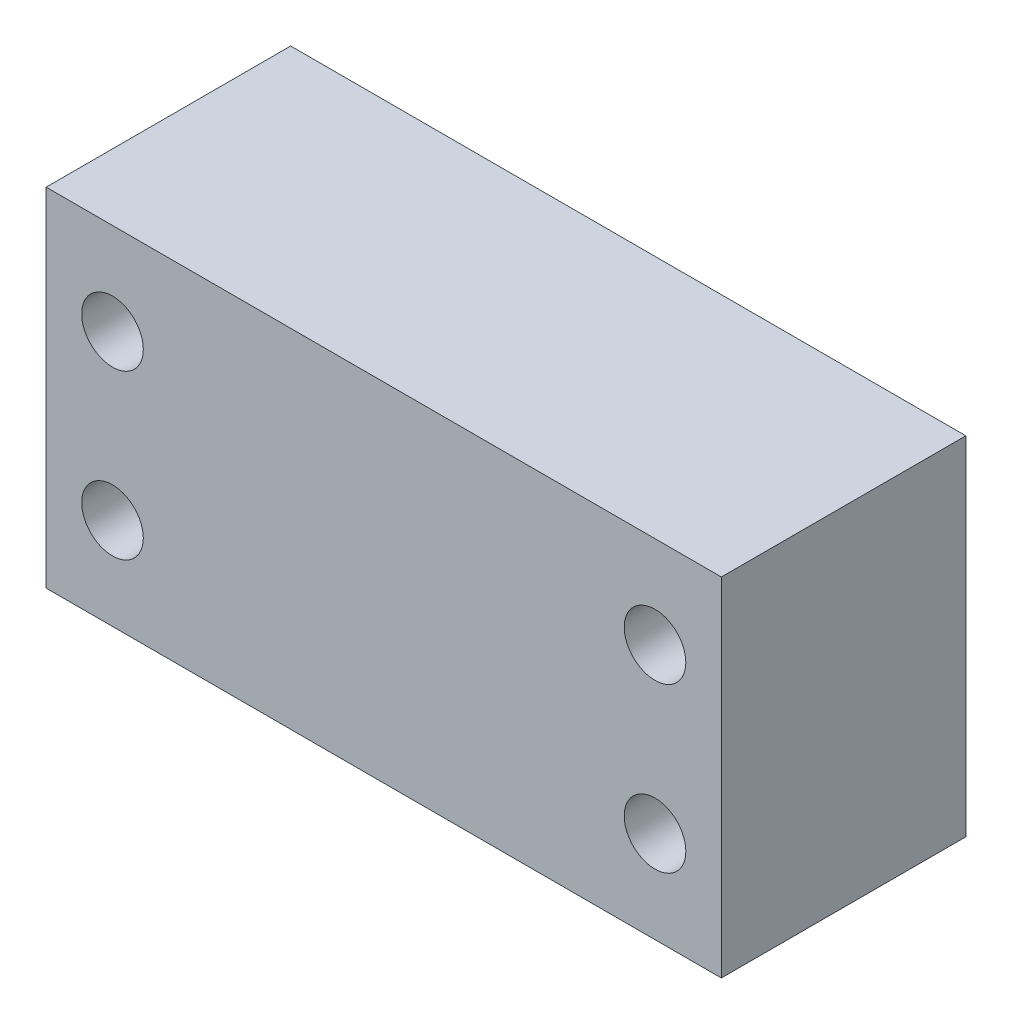
ISO-10303-21;
HEADER;
FILE_DESCRIPTION(('STEP AP214'),'2;1');
FILE_NAME('part.step','',(''),(''),'','','');
FILE_SCHEMA(('AUTOMOTIVE_DESIGN { 1 0 10303 214 1 1 1 1 }'));
ENDSEC;
DATA;
#1=APPLICATION_CONTEXT('core data for automotive mechanical design processes');
#2=APPLICATION_PROTOCOL_DEFINITION('international standard','automotive_design',2000,#1);
#3=PRODUCT_CONTEXT('',#1,'mechanical');
#4=PRODUCT('Part','Part','',(#3));
#5=PRODUCT_RELATED_PRODUCT_CATEGORY('part','',(#4));
#6=PRODUCT_DEFINITION_FORMATION('','',#4);
#7=PRODUCT_DEFINITION_CONTEXT('part definition',#1,'design');
#8=PRODUCT_DEFINITION('design','',#6,#7);
#9=PRODUCT_DEFINITION_SHAPE('','',#8);
#10=(LENGTH_UNIT() NAMED_UNIT(*) SI_UNIT(.MILLI.,.METRE.));
#11=(NAMED_UNIT(*) PLANE_ANGLE_UNIT() SI_UNIT($,.RADIAN.));
#12=(NAMED_UNIT(*) SI_UNIT($,.STERADIAN.) SOLID_ANGLE_UNIT());
#13=UNCERTAINTY_MEASURE_WITH_UNIT(LENGTH_MEASURE(1.E-05),#10,'distance_accuracy_value','');
#14=(GEOMETRIC_REPRESENTATION_CONTEXT(3) GLOBAL_UNCERTAINTY_ASSIGNED_CONTEXT((#13)) GLOBAL_UNIT_ASSIGNED_CONTEXT((#10,
#11,#12)) REPRESENTATION_CONTEXT('',''));
#15=CARTESIAN_POINT('',(0.,0.,0.));
#16=DIRECTION('',(0.,0.,1.));
#17=DIRECTION('',(1.,0.,0.));
#18=AXIS2_PLACEMENT_3D('',#15,#16,#17);
#19=CARTESIAN_POINT('',(18.0975,9.3091,13.1064));
#20=DIRECTION('',(-1.,0.,0.));
#21=DIRECTION('',(0.,0.,1.));
#22=AXIS2_PLACEMENT_3D('',#19,#20,#21);
#23=PLANE('',#22);
#24=DIRECTION('',(0.,1.,0.));
#25=VECTOR('',#24,1.);
#26=CARTESIAN_POINT('',(18.0975,9.3091,0.));
#27=LINE('',#26,#25);
#28=CARTESIAN_POINT('',(18.0975,-9.3091,0.));
#29=VERTEX_POINT('',#28);
#30=CARTESIAN_POINT('',(18.0975,9.3091,0.));
#31=VERTEX_POINT('',#30);
#32=EDGE_CURVE('E99',#29,#31,#27,.T.);
#33=ORIENTED_EDGE('',*,*,#32,.T.);
#34=DIRECTION('',(0.,0.,-1.));
#35=VECTOR('',#34,1.);
#36=CARTESIAN_POINT('',(18.0975,9.3091,13.1064));
#37=LINE('',#36,#35);
#38=CARTESIAN_POINT('',(18.0975,9.3091,13.1064));
#39=VERTEX_POINT('',#38);
#40=EDGE_CURVE('E11',#39,#31,#37,.T.);
#41=ORIENTED_EDGE('',*,*,#40,.F.);
#42=DIRECTION('',(0.,1.,0.));
#43=VECTOR('',#42,1.);
#44=CARTESIAN_POINT('',(18.0975,9.3091,13.1064));
#45=LINE('',#44,#43);
#46=CARTESIAN_POINT('',(18.0975,-9.3091,13.1064));
#47=VERTEX_POINT('',#46);
#48=EDGE_CURVE('E87',#47,#39,#45,.T.);
#49=ORIENTED_EDGE('',*,*,#48,.F.);
#50=DIRECTION('',(0.,0.,-1.));
#51=VECTOR('',#50,1.);
#52=CARTESIAN_POINT('',(18.0975,-9.3091,13.1064));
#53=LINE('',#52,#51);
#54=EDGE_CURVE('E95',#47,#29,#53,.T.);
#55=ORIENTED_EDGE('',*,*,#54,.T.);
#56=EDGE_LOOP('',(#33,#41,#49,#55));
#57=FACE_BOUND('',#56,.T.);
#58=ADVANCED_FACE('F36',(#57),#23,.F.);
#59=CARTESIAN_POINT('',(-18.0975,9.3091,13.1064));
#60=DIRECTION('',(0.,-1.,0.));
#61=DIRECTION('',(0.,0.,-1.));
#62=AXIS2_PLACEMENT_3D('',#59,#60,#61);
#63=PLANE('',#62);
#64=DIRECTION('',(-1.,0.,0.));
#65=VECTOR('',#64,1.);
#66=CARTESIAN_POINT('',(-18.0975,9.3091,0.));
#67=LINE('',#66,#65);
#68=CARTESIAN_POINT('',(-18.0975,9.3091,0.));
#69=VERTEX_POINT('',#68);
#70=EDGE_CURVE('E91',#31,#69,#67,.T.);
#71=ORIENTED_EDGE('',*,*,#70,.T.);
#72=DIRECTION('',(0.,0.,-1.));
#73=VECTOR('',#72,1.);
#74=CARTESIAN_POINT('',(-18.0975,9.3091,13.1064));
#75=LINE('',#74,#73);
#76=CARTESIAN_POINT('',(-18.0975,9.3091,13.1064));
#77=VERTEX_POINT('',#76);
#78=EDGE_CURVE('E44',#77,#69,#75,.T.);
#79=ORIENTED_EDGE('',*,*,#78,.F.);
#80=DIRECTION('',(-1.,0.,0.));
#81=VECTOR('',#80,1.);
#82=CARTESIAN_POINT('',(-18.0975,9.3091,13.1064));
#83=LINE('',#82,#81);
#84=EDGE_CURVE('E82',#39,#77,#83,.T.);
#85=ORIENTED_EDGE('',*,*,#84,.F.);
#86=ORIENTED_EDGE('',*,*,#40,.T.);
#87=EDGE_LOOP('',(#71,#79,#85,#86));
#88=FACE_BOUND('',#87,.T.);
#89=ADVANCED_FACE('F90',(#88),#63,.F.);
#90=CARTESIAN_POINT('',(-18.0975,9.3091,13.1064));
#91=DIRECTION('',(1.,0.,0.));
#92=DIRECTION('',(0.,1.,0.));
#93=AXIS2_PLACEMENT_3D('',#90,#91,#92);
#94=PLANE('',#93);
#95=DIRECTION('',(0.,-1.,0.));
#96=VECTOR('',#95,1.);
#97=CARTESIAN_POINT('',(-18.0975,9.3091,0.));
#98=LINE('',#97,#96);
#99=CARTESIAN_POINT('',(-18.0975,-9.3091,0.));
#100=VERTEX_POINT('',#99);
#101=EDGE_CURVE('E69',#69,#100,#98,.T.);
#102=ORIENTED_EDGE('',*,*,#101,.T.);
#103=DIRECTION('',(0.,0.,-1.));
#104=VECTOR('',#103,1.);
#105=CARTESIAN_POINT('',(-18.0975,-9.3091,13.1064));
#106=LINE('',#105,#104);
#107=CARTESIAN_POINT('',(-18.0975,-9.3091,13.1064));
#108=VERTEX_POINT('',#107);
#109=EDGE_CURVE('E92',#108,#100,#106,.T.);
#110=ORIENTED_EDGE('',*,*,#109,.F.);
#111=DIRECTION('',(0.,-1.,0.));
#112=VECTOR('',#111,1.);
#113=CARTESIAN_POINT('',(-18.0975,9.3091,13.1064));
#114=LINE('',#113,#112);
#115=EDGE_CURVE('E85',#77,#108,#114,.T.);
#116=ORIENTED_EDGE('',*,*,#115,.F.);
#117=ORIENTED_EDGE('',*,*,#78,.T.);
#118=EDGE_LOOP('',(#102,#110,#116,#117));
#119=FACE_BOUND('',#118,.T.);
#120=ADVANCED_FACE('F93',(#119),#94,.F.);
#121=CARTESIAN_POINT('',(-18.0975,-9.3091,13.1064));
#122=DIRECTION('',(0.,1.,0.));
#123=DIRECTION('',(0.,0.,1.));
#124=AXIS2_PLACEMENT_3D('',#121,#122,#123);
#125=PLANE('',#124);
#126=DIRECTION('',(1.,0.,0.));
#127=VECTOR('',#126,1.);
#128=CARTESIAN_POINT('',(-18.0975,-9.3091,0.));
#129=LINE('',#128,#127);
#130=EDGE_CURVE('E75',#100,#29,#129,.T.);
#131=ORIENTED_EDGE('',*,*,#130,.T.);
#132=ORIENTED_EDGE('',*,*,#54,.F.);
#133=DIRECTION('',(1.,0.,0.));
#134=VECTOR('',#133,1.);
#135=CARTESIAN_POINT('',(-18.0975,-9.3091,13.1064));
#136=LINE('',#135,#134);
#137=EDGE_CURVE('E52',#108,#47,#136,.T.);
#138=ORIENTED_EDGE('',*,*,#137,.F.);
#139=ORIENTED_EDGE('',*,*,#109,.T.);
#140=EDGE_LOOP('',(#131,#132,#138,#139));
#141=FACE_BOUND('',#140,.T.);
#142=ADVANCED_FACE('F107',(#141),#125,.F.);
#143=CARTESIAN_POINT('',(0.,0.,13.1064));
#144=DIRECTION('',(0.,0.,1.));
#145=DIRECTION('',(1.,0.,0.));
#146=AXIS2_PLACEMENT_3D('',#143,#144,#145);
#147=PLANE('',#146);
#148=CARTESIAN_POINT('',(-14.5415,-4.3815,13.1064));
#149=DIRECTION('',(0.,0.,1.));
#150=DIRECTION('',(-1.,0.,0.));
#151=AXIS2_PLACEMENT_3D('',#148,#149,#150);
#152=CIRCLE('',#151,1.651);
#153=CARTESIAN_POINT('',(-12.8905,-4.3815,13.1064));
#154=VERTEX_POINT('',#153);
#155=EDGE_CURVE('E119',#154,#154,#152,.T.);
#156=ORIENTED_EDGE('',*,*,#155,.F.);
#157=EDGE_LOOP('',(#156));
#158=FACE_BOUND('',#157,.T.);
#159=CARTESIAN_POINT('',(14.5415,-4.3815,13.1064));
#160=DIRECTION('',(0.,0.,1.));
#161=DIRECTION('',(1.,0.,0.));
#162=AXIS2_PLACEMENT_3D('',#159,#160,#161);
#163=CIRCLE('',#162,1.651);
#164=CARTESIAN_POINT('',(16.1925,-4.3815,13.1064));
#165=VERTEX_POINT('',#164);
#166=EDGE_CURVE('E125',#165,#165,#163,.T.);
#167=ORIENTED_EDGE('',*,*,#166,.F.);
#168=EDGE_LOOP('',(#167));
#169=FACE_BOUND('',#168,.T.);
#170=CARTESIAN_POINT('',(14.5415,4.3815,13.1064));
#171=DIRECTION('',(0.,0.,1.));
#172=DIRECTION('',(-1.,0.,0.));
#173=AXIS2_PLACEMENT_3D('',#170,#171,#172);
#174=CIRCLE('',#173,1.651);
#175=CARTESIAN_POINT('',(16.1925,4.3815,13.1064));
#176=VERTEX_POINT('',#175);
#177=EDGE_CURVE('E131',#176,#176,#174,.T.);
#178=ORIENTED_EDGE('',*,*,#177,.F.);
#179=EDGE_LOOP('',(#178));
#180=FACE_BOUND('',#179,.T.);
#181=CARTESIAN_POINT('',(-14.5415,4.3815,13.1064));
#182=DIRECTION('',(0.,0.,1.));
#183=DIRECTION('',(1.,0.,0.));
#184=AXIS2_PLACEMENT_3D('',#181,#182,#183);
#185=CIRCLE('',#184,1.651);
#186=CARTESIAN_POINT('',(-12.8905,4.3815,13.1064));
#187=VERTEX_POINT('',#186);
#188=EDGE_CURVE('E113',#187,#187,#185,.T.);
#189=ORIENTED_EDGE('',*,*,#188,.F.);
#190=EDGE_LOOP('',(#189));
#191=FACE_BOUND('',#190,.T.);
#192=ORIENTED_EDGE('',*,*,#48,.T.);
#193=ORIENTED_EDGE('',*,*,#84,.T.);
#194=ORIENTED_EDGE('',*,*,#115,.T.);
#195=ORIENTED_EDGE('',*,*,#137,.T.);
#196=EDGE_LOOP('',(#192,#193,#194,#195));
#197=FACE_BOUND('',#196,.T.);
#198=ADVANCED_FACE('F83',(#158,#169,#180,#191,#197),#147,.T.);
#199=CARTESIAN_POINT('',(0.,0.,0.));
#200=DIRECTION('',(0.,0.,1.));
#201=DIRECTION('',(1.,0.,0.));
#202=AXIS2_PLACEMENT_3D('',#199,#200,#201);
#203=PLANE('',#202);
#204=CARTESIAN_POINT('',(-14.5415,-4.3815,0.));
#205=DIRECTION('',(0.,0.,1.));
#206=DIRECTION('',(-1.,0.,0.));
#207=AXIS2_PLACEMENT_3D('',#204,#205,#206);
#208=CIRCLE('',#207,1.651);
#209=CARTESIAN_POINT('',(-12.8905,-4.3815,0.));
#210=VERTEX_POINT('',#209);
#211=EDGE_CURVE('E122',#210,#210,#208,.T.);
#212=ORIENTED_EDGE('',*,*,#211,.T.);
#213=EDGE_LOOP('',(#212));
#214=FACE_BOUND('',#213,.T.);
#215=CARTESIAN_POINT('',(14.5415,-4.3815,0.));
#216=DIRECTION('',(0.,0.,1.));
#217=DIRECTION('',(1.,0.,0.));
#218=AXIS2_PLACEMENT_3D('',#215,#216,#217);
#219=CIRCLE('',#218,1.651);
#220=CARTESIAN_POINT('',(16.1925,-4.3815,0.));
#221=VERTEX_POINT('',#220);
#222=EDGE_CURVE('E128',#221,#221,#219,.T.);
#223=ORIENTED_EDGE('',*,*,#222,.T.);
#224=EDGE_LOOP('',(#223));
#225=FACE_BOUND('',#224,.T.);
#226=CARTESIAN_POINT('',(14.5415,4.3815,0.));
#227=DIRECTION('',(0.,0.,1.));
#228=DIRECTION('',(-1.,0.,0.));
#229=AXIS2_PLACEMENT_3D('',#226,#227,#228);
#230=CIRCLE('',#229,1.651);
#231=CARTESIAN_POINT('',(16.1925,4.3815,0.));
#232=VERTEX_POINT('',#231);
#233=EDGE_CURVE('E116',#232,#232,#230,.T.);
#234=ORIENTED_EDGE('',*,*,#233,.T.);
#235=EDGE_LOOP('',(#234));
#236=FACE_BOUND('',#235,.T.);
#237=CARTESIAN_POINT('',(-14.5415,4.3815,0.));
#238=DIRECTION('',(0.,0.,1.));
#239=DIRECTION('',(1.,0.,0.));
#240=AXIS2_PLACEMENT_3D('',#237,#238,#239);
#241=CIRCLE('',#240,1.651);
#242=CARTESIAN_POINT('',(-12.8905,4.3815,0.));
#243=VERTEX_POINT('',#242);
#244=EDGE_CURVE('E102',#243,#243,#241,.T.);
#245=ORIENTED_EDGE('',*,*,#244,.T.);
#246=EDGE_LOOP('',(#245));
#247=FACE_BOUND('',#246,.T.);
#248=ORIENTED_EDGE('',*,*,#32,.F.);
#249=ORIENTED_EDGE('',*,*,#130,.F.);
#250=ORIENTED_EDGE('',*,*,#101,.F.);
#251=ORIENTED_EDGE('',*,*,#70,.F.);
#252=EDGE_LOOP('',(#248,#249,#250,#251));
#253=FACE_BOUND('',#252,.T.);
#254=ADVANCED_FACE('F110',(#214,#225,#236,#247,#253),#203,.F.);
#255=CARTESIAN_POINT('',(-14.5415,4.3815,0.));
#256=DIRECTION('',(0.,0.,1.));
#257=DIRECTION('',(1.,0.,0.));
#258=AXIS2_PLACEMENT_3D('',#255,#256,#257);
#259=CYLINDRICAL_SURFACE('',#258,1.651);
#260=CARTESIAN_POINT('',(-12.8905,4.3815,0.));
#261=CARTESIAN_POINT('',(-12.8905,4.3815,0.136525));
#262=CARTESIAN_POINT('',(-12.8905,4.3815,0.27305));
#263=CARTESIAN_POINT('',(-12.8905,4.3815,0.5461));
#264=CARTESIAN_POINT('',(-12.8905,4.3815,0.682625));
#265=CARTESIAN_POINT('',(-12.8905,4.3815,0.955675));
#266=CARTESIAN_POINT('',(-12.8905,4.3815,1.0922));
#267=CARTESIAN_POINT('',(-12.8905,4.3815,1.36525));
#268=CARTESIAN_POINT('',(-12.8905,4.3815,1.501775));
#269=CARTESIAN_POINT('',(-12.8905,4.3815,1.774825));
#270=CARTESIAN_POINT('',(-12.8905,4.3815,1.91135));
#271=CARTESIAN_POINT('',(-12.8905,4.3815,2.1844));
#272=CARTESIAN_POINT('',(-12.8905,4.3815,2.320925));
#273=CARTESIAN_POINT('',(-12.8905,4.3815,2.593975));
#274=CARTESIAN_POINT('',(-12.8905,4.3815,2.7305));
#275=CARTESIAN_POINT('',(-12.8905,4.3815,3.00355));
#276=CARTESIAN_POINT('',(-12.8905,4.3815,3.140075));
#277=CARTESIAN_POINT('',(-12.8905,4.3815,3.413125));
#278=CARTESIAN_POINT('',(-12.8905,4.3815,3.54965));
#279=CARTESIAN_POINT('',(-12.8905,4.3815,3.8227));
#280=CARTESIAN_POINT('',(-12.8905,4.3815,3.959225));
#281=CARTESIAN_POINT('',(-12.8905,4.3815,4.232275));
#282=CARTESIAN_POINT('',(-12.8905,4.3815,4.3688));
#283=CARTESIAN_POINT('',(-12.8905,4.3815,4.64185));
#284=CARTESIAN_POINT('',(-12.8905,4.3815,4.778375));
#285=CARTESIAN_POINT('',(-12.8905,4.3815,5.051425));
#286=CARTESIAN_POINT('',(-12.8905,4.3815,5.18795));
#287=CARTESIAN_POINT('',(-12.8905,4.3815,5.461));
#288=CARTESIAN_POINT('',(-12.8905,4.3815,5.597525));
#289=CARTESIAN_POINT('',(-12.8905,4.3815,5.870575));
#290=CARTESIAN_POINT('',(-12.8905,4.3815,6.0071));
#291=CARTESIAN_POINT('',(-12.8905,4.3815,6.28015));
#292=CARTESIAN_POINT('',(-12.8905,4.3815,6.416675));
#293=CARTESIAN_POINT('',(-12.8905,4.3815,6.689725));
#294=CARTESIAN_POINT('',(-12.8905,4.3815,6.82625));
#295=CARTESIAN_POINT('',(-12.8905,4.3815,7.0993));
#296=CARTESIAN_POINT('',(-12.8905,4.3815,7.235825));
#297=CARTESIAN_POINT('',(-12.8905,4.3815,7.508875));
#298=CARTESIAN_POINT('',(-12.8905,4.3815,7.6454));
#299=CARTESIAN_POINT('',(-12.8905,4.3815,7.91845));
#300=CARTESIAN_POINT('',(-12.8905,4.3815,8.054975));
#301=CARTESIAN_POINT('',(-12.8905,4.3815,8.328025));
#302=CARTESIAN_POINT('',(-12.8905,4.3815,8.46455));
#303=CARTESIAN_POINT('',(-12.8905,4.3815,8.7376));
#304=CARTESIAN_POINT('',(-12.8905,4.3815,8.874125));
#305=CARTESIAN_POINT('',(-12.8905,4.3815,9.147175));
#306=CARTESIAN_POINT('',(-12.8905,4.3815,9.2837));
#307=CARTESIAN_POINT('',(-12.8905,4.3815,9.55675));
#308=CARTESIAN_POINT('',(-12.8905,4.3815,9.693275));
#309=CARTESIAN_POINT('',(-12.8905,4.3815,9.966325));
#310=CARTESIAN_POINT('',(-12.8905,4.3815,10.10285));
#311=CARTESIAN_POINT('',(-12.8905,4.3815,10.3759));
#312=CARTESIAN_POINT('',(-12.8905,4.3815,10.512425));
#313=CARTESIAN_POINT('',(-12.8905,4.3815,10.785475));
#314=CARTESIAN_POINT('',(-12.8905,4.3815,10.922));
#315=CARTESIAN_POINT('',(-12.8905,4.3815,11.19505));
#316=CARTESIAN_POINT('',(-12.8905,4.3815,11.331575));
#317=CARTESIAN_POINT('',(-12.8905,4.3815,11.604625));
#318=CARTESIAN_POINT('',(-12.8905,4.3815,11.74115));
#319=CARTESIAN_POINT('',(-12.8905,4.3815,12.0142));
#320=CARTESIAN_POINT('',(-12.8905,4.3815,12.150725));
#321=CARTESIAN_POINT('',(-12.8905,4.3815,12.423775));
#322=CARTESIAN_POINT('',(-12.8905,4.3815,12.5603));
#323=CARTESIAN_POINT('',(-12.8905,4.3815,12.83335));
#324=CARTESIAN_POINT('',(-12.8905,4.3815,12.969875));
#325=CARTESIAN_POINT('',(-12.8905,4.3815,13.1064));
#326=B_SPLINE_CURVE_WITH_KNOTS('',3,(#260,#261,#262,#263,#264,#265,#266,#267,#268,#269,#270,
#271,#272,#273,#274,#275,#276,#277,#278,#279,#280,#281,#282,#283,#284,#285,#286,#287,#288,#289,
#290,#291,#292,#293,#294,#295,#296,#297,#298,#299,#300,#301,#302,#303,#304,#305,#306,#307,#308,
#309,#310,#311,#312,#313,#314,#315,#316,#317,#318,#319,#320,#321,#322,#323,#324,#325),
.UNSPECIFIED.,.F.,.F.,(4,2,2,2,2,2,2,2,2,2,2,2,2,2,2,2,2,2,2,2,2,2,2,2,2,2,2,2,2,2,2,2,4),(0.,
0.409575,0.81915,1.228725,1.6383,2.047875,2.45745,2.867025,3.2766,3.686175,4.09575,4.505325,
4.9149,5.324475,5.73405,6.143625,6.5532,6.962775,7.37235,7.781925,8.1915,8.601075,9.01065,
9.420225,9.8298,10.239375,10.64895,11.058525,11.4681,11.877675,12.28725,12.696825,13.1064),.UNSPECIFIED.);
#327=EDGE_CURVE('BSEAM143',#243,#187,#326,.T.);
#328=ORIENTED_EDGE('',*,*,#244,.F.);
#329=ORIENTED_EDGE('',*,*,#188,.T.);
#330=ORIENTED_EDGE('',*,*,#327,.T.);
#331=ORIENTED_EDGE('',*,*,#327,.F.);
#332=EDGE_LOOP('',(#328,#330,#329,#331));
#333=FACE_BOUND('',#332,.T.);
#334=ADVANCED_FACE('F143',(#333),#259,.F.);
#335=CARTESIAN_POINT('',(14.5415,4.3815,0.));
#336=DIRECTION('',(0.,0.,1.));
#337=DIRECTION('',(1.,0.,0.));
#338=AXIS2_PLACEMENT_3D('',#335,#336,#337);
#339=CYLINDRICAL_SURFACE('',#338,1.651);
#340=CARTESIAN_POINT('',(16.1925,4.3815,0.));
#341=CARTESIAN_POINT('',(16.1925,4.3815,0.136525));
#342=CARTESIAN_POINT('',(16.1925,4.3815,0.27305));
#343=CARTESIAN_POINT('',(16.1925,4.3815,0.5461));
#344=CARTESIAN_POINT('',(16.1925,4.3815,0.682625));
#345=CARTESIAN_POINT('',(16.1925,4.3815,0.955675));
#346=CARTESIAN_POINT('',(16.1925,4.3815,1.0922));
#347=CARTESIAN_POINT('',(16.1925,4.3815,1.36525));
#348=CARTESIAN_POINT('',(16.1925,4.3815,1.501775));
#349=CARTESIAN_POINT('',(16.1925,4.3815,1.774825));
#350=CARTESIAN_POINT('',(16.1925,4.3815,1.91135));
#351=CARTESIAN_POINT('',(16.1925,4.3815,2.1844));
#352=CARTESIAN_POINT('',(16.1925,4.3815,2.320925));
#353=CARTESIAN_POINT('',(16.1925,4.3815,2.593975));
#354=CARTESIAN_POINT('',(16.1925,4.3815,2.7305));
#355=CARTESIAN_POINT('',(16.1925,4.3815,3.00355));
#356=CARTESIAN_POINT('',(16.1925,4.3815,3.140075));
#357=CARTESIAN_POINT('',(16.1925,4.3815,3.413125));
#358=CARTESIAN_POINT('',(16.1925,4.3815,3.54965));
#359=CARTESIAN_POINT('',(16.1925,4.3815,3.8227));
#360=CARTESIAN_POINT('',(16.1925,4.3815,3.959225));
#361=CARTESIAN_POINT('',(16.1925,4.3815,4.232275));
#362=CARTESIAN_POINT('',(16.1925,4.3815,4.3688));
#363=CARTESIAN_POINT('',(16.1925,4.3815,4.64185));
#364=CARTESIAN_POINT('',(16.1925,4.3815,4.778375));
#365=CARTESIAN_POINT('',(16.1925,4.3815,5.051425));
#366=CARTESIAN_POINT('',(16.1925,4.3815,5.18795));
#367=CARTESIAN_POINT('',(16.1925,4.3815,5.461));
#368=CARTESIAN_POINT('',(16.1925,4.3815,5.597525));
#369=CARTESIAN_POINT('',(16.1925,4.3815,5.870575));
#370=CARTESIAN_POINT('',(16.1925,4.3815,6.0071));
#371=CARTESIAN_POINT('',(16.1925,4.3815,6.28015));
#372=CARTESIAN_POINT('',(16.1925,4.3815,6.416675));
#373=CARTESIAN_POINT('',(16.1925,4.3815,6.689725));
#374=CARTESIAN_POINT('',(16.1925,4.3815,6.82625));
#375=CARTESIAN_POINT('',(16.1925,4.3815,7.0993));
#376=CARTESIAN_POINT('',(16.1925,4.3815,7.235825));
#377=CARTESIAN_POINT('',(16.1925,4.3815,7.508875));
#378=CARTESIAN_POINT('',(16.1925,4.3815,7.6454));
#379=CARTESIAN_POINT('',(16.1925,4.3815,7.91845));
#380=CARTESIAN_POINT('',(16.1925,4.3815,8.054975));
#381=CARTESIAN_POINT('',(16.1925,4.3815,8.328025));
#382=CARTESIAN_POINT('',(16.1925,4.3815,8.46455));
#383=CARTESIAN_POINT('',(16.1925,4.3815,8.7376));
#384=CARTESIAN_POINT('',(16.1925,4.3815,8.874125));
#385=CARTESIAN_POINT('',(16.1925,4.3815,9.147175));
#386=CARTESIAN_POINT('',(16.1925,4.3815,9.2837));
#387=CARTESIAN_POINT('',(16.1925,4.3815,9.55675));
#388=CARTESIAN_POINT('',(16.1925,4.3815,9.693275));
#389=CARTESIAN_POINT('',(16.1925,4.3815,9.966325));
#390=CARTESIAN_POINT('',(16.1925,4.3815,10.10285));
#391=CARTESIAN_POINT('',(16.1925,4.3815,10.3759));
#392=CARTESIAN_POINT('',(16.1925,4.3815,10.512425));
#393=CARTESIAN_POINT('',(16.1925,4.3815,10.785475));
#394=CARTESIAN_POINT('',(16.1925,4.3815,10.922));
#395=CARTESIAN_POINT('',(16.1925,4.3815,11.19505));
#396=CARTESIAN_POINT('',(16.1925,4.3815,11.331575));
#397=CARTESIAN_POINT('',(16.1925,4.3815,11.604625));
#398=CARTESIAN_POINT('',(16.1925,4.3815,11.74115));
#399=CARTESIAN_POINT('',(16.1925,4.3815,12.0142));
#400=CARTESIAN_POINT('',(16.1925,4.3815,12.150725));
#401=CARTESIAN_POINT('',(16.1925,4.3815,12.423775));
#402=CARTESIAN_POINT('',(16.1925,4.3815,12.5603));
#403=CARTESIAN_POINT('',(16.1925,4.3815,12.83335));
#404=CARTESIAN_POINT('',(16.1925,4.3815,12.969875));
#405=CARTESIAN_POINT('',(16.1925,4.3815,13.1064));
#406=B_SPLINE_CURVE_WITH_KNOTS('',3,(#340,#341,#342,#343,#344,#345,#346,#347,#348,#349,#350,
#351,#352,#353,#354,#355,#356,#357,#358,#359,#360,#361,#362,#363,#364,#365,#366,#367,#368,#369,
#370,#371,#372,#373,#374,#375,#376,#377,#378,#379,#380,#381,#382,#383,#384,#385,#386,#387,#388,
#389,#390,#391,#392,#393,#394,#395,#396,#397,#398,#399,#400,#401,#402,#403,#404,#405),
.UNSPECIFIED.,.F.,.F.,(4,2,2,2,2,2,2,2,2,2,2,2,2,2,2,2,2,2,2,2,2,2,2,2,2,2,2,2,2,2,2,2,4),(0.,
0.409575,0.81915,1.228725,1.6383,2.047875,2.45745,2.867025,3.2766,3.686175,4.09575,4.505325,
4.9149,5.324475,5.73405,6.143625,6.5532,6.962775,7.37235,7.781925,8.1915,8.601075,9.01065,
9.420225,9.8298,10.239375,10.64895,11.058525,11.4681,11.877675,12.28725,12.696825,13.1064),.UNSPECIFIED.);
#407=EDGE_CURVE('BSEAM139',#232,#176,#406,.T.);
#408=ORIENTED_EDGE('',*,*,#233,.F.);
#409=ORIENTED_EDGE('',*,*,#177,.T.);
#410=ORIENTED_EDGE('',*,*,#407,.T.);
#411=ORIENTED_EDGE('',*,*,#407,.F.);
#412=EDGE_LOOP('',(#408,#410,#409,#411));
#413=FACE_BOUND('',#412,.T.);
#414=ADVANCED_FACE('F139',(#413),#339,.F.);
#415=CARTESIAN_POINT('',(14.5415,-4.3815,0.));
#416=DIRECTION('',(0.,0.,1.));
#417=DIRECTION('',(1.,0.,0.));
#418=AXIS2_PLACEMENT_3D('',#415,#416,#417);
#419=CYLINDRICAL_SURFACE('',#418,1.651);
#420=CARTESIAN_POINT('',(16.1925,-4.3815,0.));
#421=CARTESIAN_POINT('',(16.1925,-4.3815,0.136525));
#422=CARTESIAN_POINT('',(16.1925,-4.3815,0.27305));
#423=CARTESIAN_POINT('',(16.1925,-4.3815,0.5461));
#424=CARTESIAN_POINT('',(16.1925,-4.3815,0.682625));
#425=CARTESIAN_POINT('',(16.1925,-4.3815,0.955675));
#426=CARTESIAN_POINT('',(16.1925,-4.3815,1.0922));
#427=CARTESIAN_POINT('',(16.1925,-4.3815,1.36525));
#428=CARTESIAN_POINT('',(16.1925,-4.3815,1.501775));
#429=CARTESIAN_POINT('',(16.1925,-4.3815,1.774825));
#430=CARTESIAN_POINT('',(16.1925,-4.3815,1.91135));
#431=CARTESIAN_POINT('',(16.1925,-4.3815,2.1844));
#432=CARTESIAN_POINT('',(16.1925,-4.3815,2.320925));
#433=CARTESIAN_POINT('',(16.1925,-4.3815,2.593975));
#434=CARTESIAN_POINT('',(16.1925,-4.3815,2.7305));
#435=CARTESIAN_POINT('',(16.1925,-4.3815,3.00355));
#436=CARTESIAN_POINT('',(16.1925,-4.3815,3.140075));
#437=CARTESIAN_POINT('',(16.1925,-4.3815,3.413125));
#438=CARTESIAN_POINT('',(16.1925,-4.3815,3.54965));
#439=CARTESIAN_POINT('',(16.1925,-4.3815,3.8227));
#440=CARTESIAN_POINT('',(16.1925,-4.3815,3.959225));
#441=CARTESIAN_POINT('',(16.1925,-4.3815,4.232275));
#442=CARTESIAN_POINT('',(16.1925,-4.3815,4.3688));
#443=CARTESIAN_POINT('',(16.1925,-4.3815,4.64185));
#444=CARTESIAN_POINT('',(16.1925,-4.3815,4.778375));
#445=CARTESIAN_POINT('',(16.1925,-4.3815,5.051425));
#446=CARTESIAN_POINT('',(16.1925,-4.3815,5.18795));
#447=CARTESIAN_POINT('',(16.1925,-4.3815,5.461));
#448=CARTESIAN_POINT('',(16.1925,-4.3815,5.597525));
#449=CARTESIAN_POINT('',(16.1925,-4.3815,5.870575));
#450=CARTESIAN_POINT('',(16.1925,-4.3815,6.0071));
#451=CARTESIAN_POINT('',(16.1925,-4.3815,6.28015));
#452=CARTESIAN_POINT('',(16.1925,-4.3815,6.416675));
#453=CARTESIAN_POINT('',(16.1925,-4.3815,6.689725));
#454=CARTESIAN_POINT('',(16.1925,-4.3815,6.82625));
#455=CARTESIAN_POINT('',(16.1925,-4.3815,7.0993));
#456=CARTESIAN_POINT('',(16.1925,-4.3815,7.235825));
#457=CARTESIAN_POINT('',(16.1925,-4.3815,7.508875));
#458=CARTESIAN_POINT('',(16.1925,-4.3815,7.6454));
#459=CARTESIAN_POINT('',(16.1925,-4.3815,7.91845));
#460=CARTESIAN_POINT('',(16.1925,-4.3815,8.054975));
#461=CARTESIAN_POINT('',(16.1925,-4.3815,8.328025));
#462=CARTESIAN_POINT('',(16.1925,-4.3815,8.46455));
#463=CARTESIAN_POINT('',(16.1925,-4.3815,8.7376));
#464=CARTESIAN_POINT('',(16.1925,-4.3815,8.874125));
#465=CARTESIAN_POINT('',(16.1925,-4.3815,9.147175));
#466=CARTESIAN_POINT('',(16.1925,-4.3815,9.2837));
#467=CARTESIAN_POINT('',(16.1925,-4.3815,9.55675));
#468=CARTESIAN_POINT('',(16.1925,-4.3815,9.693275));
#469=CARTESIAN_POINT('',(16.1925,-4.3815,9.966325));
#470=CARTESIAN_POINT('',(16.1925,-4.3815,10.10285));
#471=CARTESIAN_POINT('',(16.1925,-4.3815,10.3759));
#472=CARTESIAN_POINT('',(16.1925,-4.3815,10.512425));
#473=CARTESIAN_POINT('',(16.1925,-4.3815,10.785475));
#474=CARTESIAN_POINT('',(16.1925,-4.3815,10.922));
#475=CARTESIAN_POINT('',(16.1925,-4.3815,11.19505));
#476=CARTESIAN_POINT('',(16.1925,-4.3815,11.331575));
#477=CARTESIAN_POINT('',(16.1925,-4.3815,11.604625));
#478=CARTESIAN_POINT('',(16.1925,-4.3815,11.74115));
#479=CARTESIAN_POINT('',(16.1925,-4.3815,12.0142));
#480=CARTESIAN_POINT('',(16.1925,-4.3815,12.150725));
#481=CARTESIAN_POINT('',(16.1925,-4.3815,12.423775));
#482=CARTESIAN_POINT('',(16.1925,-4.3815,12.5603));
#483=CARTESIAN_POINT('',(16.1925,-4.3815,12.83335));
#484=CARTESIAN_POINT('',(16.1925,-4.3815,12.969875));
#485=CARTESIAN_POINT('',(16.1925,-4.3815,13.1064));
#486=B_SPLINE_CURVE_WITH_KNOTS('',3,(#420,#421,#422,#423,#424,#425,#426,#427,#428,#429,#430,
#431,#432,#433,#434,#435,#436,#437,#438,#439,#440,#441,#442,#443,#444,#445,#446,#447,#448,#449,
#450,#451,#452,#453,#454,#455,#456,#457,#458,#459,#460,#461,#462,#463,#464,#465,#466,#467,#468,
#469,#470,#471,#472,#473,#474,#475,#476,#477,#478,#479,#480,#481,#482,#483,#484,#485),
.UNSPECIFIED.,.F.,.F.,(4,2,2,2,2,2,2,2,2,2,2,2,2,2,2,2,2,2,2,2,2,2,2,2,2,2,2,2,2,2,2,2,4),(0.,
0.409575,0.81915,1.228725,1.6383,2.047875,2.45745,2.867025,3.2766,3.686175,4.09575,4.505325,
4.9149,5.324475,5.73405,6.143625,6.5532,6.962775,7.37235,7.781925,8.1915,8.601075,9.01065,
9.420225,9.8298,10.239375,10.64895,11.058525,11.4681,11.877675,12.28725,12.696825,13.1064),.UNSPECIFIED.);
#487=EDGE_CURVE('BSEAM142',#221,#165,#486,.T.);
#488=ORIENTED_EDGE('',*,*,#222,.F.);
#489=ORIENTED_EDGE('',*,*,#166,.T.);
#490=ORIENTED_EDGE('',*,*,#487,.T.);
#491=ORIENTED_EDGE('',*,*,#487,.F.);
#492=EDGE_LOOP('',(#488,#490,#489,#491));
#493=FACE_BOUND('',#492,.T.);
#494=ADVANCED_FACE('F142',(#493),#419,.F.);
#495=CARTESIAN_POINT('',(-14.5415,-4.3815,0.));
#496=DIRECTION('',(0.,0.,1.));
#497=DIRECTION('',(1.,0.,0.));
#498=AXIS2_PLACEMENT_3D('',#495,#496,#497);
#499=CYLINDRICAL_SURFACE('',#498,1.651);
#500=CARTESIAN_POINT('',(-12.8905,-4.3815,0.));
#501=CARTESIAN_POINT('',(-12.8905,-4.3815,0.136525));
#502=CARTESIAN_POINT('',(-12.8905,-4.3815,0.27305));
#503=CARTESIAN_POINT('',(-12.8905,-4.3815,0.5461));
#504=CARTESIAN_POINT('',(-12.8905,-4.3815,0.682625));
#505=CARTESIAN_POINT('',(-12.8905,-4.3815,0.955675));
#506=CARTESIAN_POINT('',(-12.8905,-4.3815,1.0922));
#507=CARTESIAN_POINT('',(-12.8905,-4.3815,1.36525));
#508=CARTESIAN_POINT('',(-12.8905,-4.3815,1.501775));
#509=CARTESIAN_POINT('',(-12.8905,-4.3815,1.774825));
#510=CARTESIAN_POINT('',(-12.8905,-4.3815,1.91135));
#511=CARTESIAN_POINT('',(-12.8905,-4.3815,2.1844));
#512=CARTESIAN_POINT('',(-12.8905,-4.3815,2.320925));
#513=CARTESIAN_POINT('',(-12.8905,-4.3815,2.593975));
#514=CARTESIAN_POINT('',(-12.8905,-4.3815,2.7305));
#515=CARTESIAN_POINT('',(-12.8905,-4.3815,3.00355));
#516=CARTESIAN_POINT('',(-12.8905,-4.3815,3.140075));
#517=CARTESIAN_POINT('',(-12.8905,-4.3815,3.413125));
#518=CARTESIAN_POINT('',(-12.8905,-4.3815,3.54965));
#519=CARTESIAN_POINT('',(-12.8905,-4.3815,3.8227));
#520=CARTESIAN_POINT('',(-12.8905,-4.3815,3.959225));
#521=CARTESIAN_POINT('',(-12.8905,-4.3815,4.232275));
#522=CARTESIAN_POINT('',(-12.8905,-4.3815,4.3688));
#523=CARTESIAN_POINT('',(-12.8905,-4.3815,4.64185));
#524=CARTESIAN_POINT('',(-12.8905,-4.3815,4.778375));
#525=CARTESIAN_POINT('',(-12.8905,-4.3815,5.051425));
#526=CARTESIAN_POINT('',(-12.8905,-4.3815,5.18795));
#527=CARTESIAN_POINT('',(-12.8905,-4.3815,5.461));
#528=CARTESIAN_POINT('',(-12.8905,-4.3815,5.597525));
#529=CARTESIAN_POINT('',(-12.8905,-4.3815,5.870575));
#530=CARTESIAN_POINT('',(-12.8905,-4.3815,6.0071));
#531=CARTESIAN_POINT('',(-12.8905,-4.3815,6.28015));
#532=CARTESIAN_POINT('',(-12.8905,-4.3815,6.416675));
#533=CARTESIAN_POINT('',(-12.8905,-4.3815,6.689725));
#534=CARTESIAN_POINT('',(-12.8905,-4.3815,6.82625));
#535=CARTESIAN_POINT('',(-12.8905,-4.3815,7.0993));
#536=CARTESIAN_POINT('',(-12.8905,-4.3815,7.235825));
#537=CARTESIAN_POINT('',(-12.8905,-4.3815,7.508875));
#538=CARTESIAN_POINT('',(-12.8905,-4.3815,7.6454));
#539=CARTESIAN_POINT('',(-12.8905,-4.3815,7.91845));
#540=CARTESIAN_POINT('',(-12.8905,-4.3815,8.054975));
#541=CARTESIAN_POINT('',(-12.8905,-4.3815,8.328025));
#542=CARTESIAN_POINT('',(-12.8905,-4.3815,8.46455));
#543=CARTESIAN_POINT('',(-12.8905,-4.3815,8.7376));
#544=CARTESIAN_POINT('',(-12.8905,-4.3815,8.874125));
#545=CARTESIAN_POINT('',(-12.8905,-4.3815,9.147175));
#546=CARTESIAN_POINT('',(-12.8905,-4.3815,9.2837));
#547=CARTESIAN_POINT('',(-12.8905,-4.3815,9.55675));
#548=CARTESIAN_POINT('',(-12.8905,-4.3815,9.693275));
#549=CARTESIAN_POINT('',(-12.8905,-4.3815,9.966325));
#550=CARTESIAN_POINT('',(-12.8905,-4.3815,10.10285));
#551=CARTESIAN_POINT('',(-12.8905,-4.3815,10.3759));
#552=CARTESIAN_POINT('',(-12.8905,-4.3815,10.512425));
#553=CARTESIAN_POINT('',(-12.8905,-4.3815,10.785475));
#554=CARTESIAN_POINT('',(-12.8905,-4.3815,10.922));
#555=CARTESIAN_POINT('',(-12.8905,-4.3815,11.19505));
#556=CARTESIAN_POINT('',(-12.8905,-4.3815,11.331575));
#557=CARTESIAN_POINT('',(-12.8905,-4.3815,11.604625));
#558=CARTESIAN_POINT('',(-12.8905,-4.3815,11.74115));
#559=CARTESIAN_POINT('',(-12.8905,-4.3815,12.0142));
#560=CARTESIAN_POINT('',(-12.8905,-4.3815,12.150725));
#561=CARTESIAN_POINT('',(-12.8905,-4.3815,12.423775));
#562=CARTESIAN_POINT('',(-12.8905,-4.3815,12.5603));
#563=CARTESIAN_POINT('',(-12.8905,-4.3815,12.83335));
#564=CARTESIAN_POINT('',(-12.8905,-4.3815,12.969875));
#565=CARTESIAN_POINT('',(-12.8905,-4.3815,13.1064));
#566=B_SPLINE_CURVE_WITH_KNOTS('',3,(#500,#501,#502,#503,#504,#505,#506,#507,#508,#509,#510,
#511,#512,#513,#514,#515,#516,#517,#518,#519,#520,#521,#522,#523,#524,#525,#526,#527,#528,#529,
#530,#531,#532,#533,#534,#535,#536,#537,#538,#539,#540,#541,#542,#543,#544,#545,#546,#547,#548,
#549,#550,#551,#552,#553,#554,#555,#556,#557,#558,#559,#560,#561,#562,#563,#564,#565),
.UNSPECIFIED.,.F.,.F.,(4,2,2,2,2,2,2,2,2,2,2,2,2,2,2,2,2,2,2,2,2,2,2,2,2,2,2,2,2,2,2,2,4),(0.,
0.409575,0.81915,1.228725,1.6383,2.047875,2.45745,2.867025,3.2766,3.686175,4.09575,4.505325,
4.9149,5.324475,5.73405,6.143625,6.5532,6.962775,7.37235,7.781925,8.1915,8.601075,9.01065,
9.420225,9.8298,10.239375,10.64895,11.058525,11.4681,11.877675,12.28725,12.696825,13.1064),.UNSPECIFIED.);
#567=EDGE_CURVE('BSEAM204',#210,#154,#566,.T.);
#568=ORIENTED_EDGE('',*,*,#211,.F.);
#569=ORIENTED_EDGE('',*,*,#155,.T.);
#570=ORIENTED_EDGE('',*,*,#567,.T.);
#571=ORIENTED_EDGE('',*,*,#567,.F.);
#572=EDGE_LOOP('',(#568,#570,#569,#571));
#573=FACE_BOUND('',#572,.T.);
#574=ADVANCED_FACE('F204',(#573),#499,.F.);
#575=CLOSED_SHELL('',(#58,#89,#120,#142,#198,#254,#334,#414,#494,#574));
#576=MANIFOLD_SOLID_BREP('B2',#575);
#577=ADVANCED_BREP_SHAPE_REPRESENTATION('',(#18,#576),#14);
#578=SHAPE_DEFINITION_REPRESENTATION(#9,#577);
ENDSEC;
END-ISO-10303-21;
